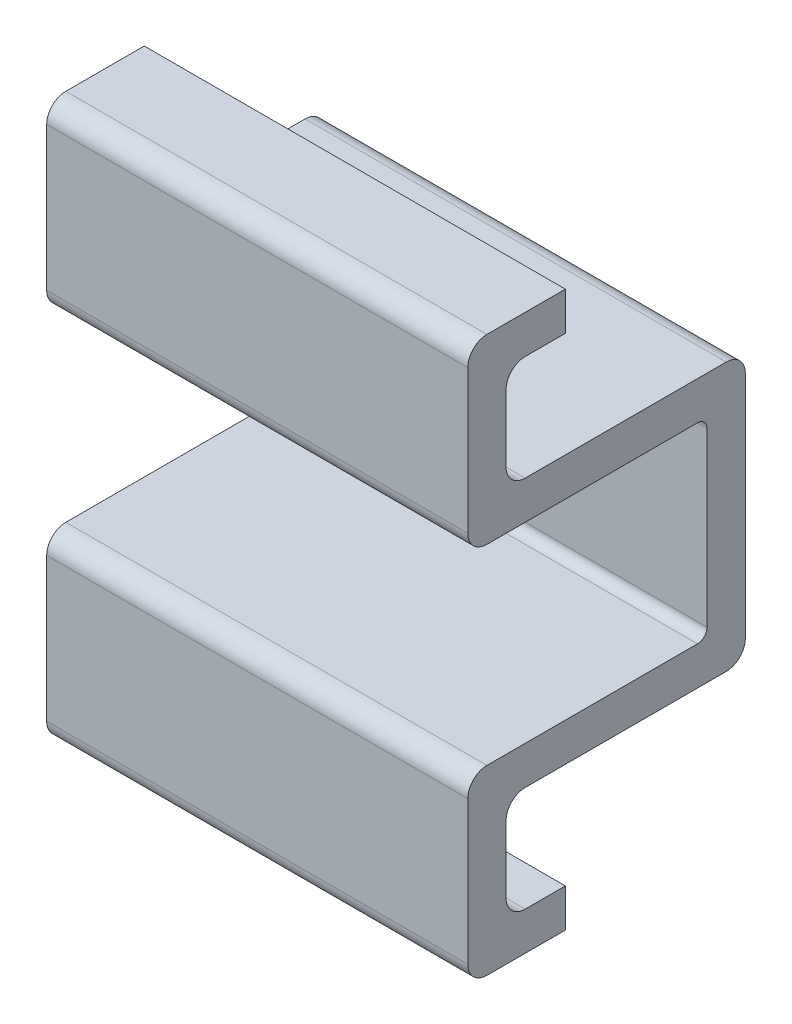
ISO-10303-21;
HEADER;
FILE_DESCRIPTION(('STEP AP214'),'2;1');
FILE_NAME('part.step','',(''),(''),'','','');
FILE_SCHEMA(('AUTOMOTIVE_DESIGN { 1 0 10303 214 1 1 1 1 }'));
ENDSEC;
DATA;
#1=APPLICATION_CONTEXT('core data for automotive mechanical design processes');
#2=APPLICATION_PROTOCOL_DEFINITION('international standard','automotive_design',2000,#1);
#3=PRODUCT_CONTEXT('',#1,'mechanical');
#4=PRODUCT('Part','Part','',(#3));
#5=PRODUCT_RELATED_PRODUCT_CATEGORY('part','',(#4));
#6=PRODUCT_DEFINITION_FORMATION('','',#4);
#7=PRODUCT_DEFINITION_CONTEXT('part definition',#1,'design');
#8=PRODUCT_DEFINITION('design','',#6,#7);
#9=PRODUCT_DEFINITION_SHAPE('','',#8);
#10=(LENGTH_UNIT() NAMED_UNIT(*) SI_UNIT(.MILLI.,.METRE.));
#11=(NAMED_UNIT(*) PLANE_ANGLE_UNIT() SI_UNIT($,.RADIAN.));
#12=(NAMED_UNIT(*) SI_UNIT($,.STERADIAN.) SOLID_ANGLE_UNIT());
#13=UNCERTAINTY_MEASURE_WITH_UNIT(LENGTH_MEASURE(1.E-05),#10,'distance_accuracy_value','');
#14=(GEOMETRIC_REPRESENTATION_CONTEXT(3) GLOBAL_UNCERTAINTY_ASSIGNED_CONTEXT((#13)) GLOBAL_UNIT_ASSIGNED_CONTEXT((#10,
#11,#12)) REPRESENTATION_CONTEXT('',''));
#15=CARTESIAN_POINT('',(0.,0.,0.));
#16=DIRECTION('',(0.,0.,1.));
#17=DIRECTION('',(1.,0.,0.));
#18=AXIS2_PLACEMENT_3D('',#15,#16,#17);
#19=CARTESIAN_POINT('',(22.,0.,13.1316966964459));
#20=DIRECTION('',(0.,0.,1.));
#21=DIRECTION('',(1.,0.,0.));
#22=AXIS2_PLACEMENT_3D('',#19,#20,#21);
#23=PLANE('',#22);
#24=DIRECTION('',(0.,1.,0.));
#25=VECTOR('',#24,1.);
#26=CARTESIAN_POINT('',(0.,0.,13.1316966964459));
#27=LINE('',#26,#25);
#28=CARTESIAN_POINT('',(0.,-14.5,13.1316966964459));
#29=VERTEX_POINT('',#28);
#30=CARTESIAN_POINT('',(0.,-12.5,13.1316966964459));
#31=VERTEX_POINT('',#30);
#32=EDGE_CURVE('E244',#29,#31,#27,.T.);
#33=ORIENTED_EDGE('',*,*,#32,.T.);
#34=DIRECTION('',(-1.,0.,0.));
#35=VECTOR('',#34,1.);
#36=CARTESIAN_POINT('',(22.,-12.5,13.1316966964459));
#37=LINE('',#36,#35);
#38=CARTESIAN_POINT('',(22.,-12.5,13.1316966964459));
#39=VERTEX_POINT('',#38);
#40=EDGE_CURVE('E225',#39,#31,#37,.T.);
#41=ORIENTED_EDGE('',*,*,#40,.F.);
#42=DIRECTION('',(0.,1.,0.));
#43=VECTOR('',#42,1.);
#44=CARTESIAN_POINT('',(22.,0.,13.1316966964459));
#45=LINE('',#44,#43);
#46=CARTESIAN_POINT('',(22.,-14.5,13.1316966964459));
#47=VERTEX_POINT('',#46);
#48=EDGE_CURVE('E231',#47,#39,#45,.T.);
#49=ORIENTED_EDGE('',*,*,#48,.F.);
#50=DIRECTION('',(-1.,0.,0.));
#51=VECTOR('',#50,1.);
#52=CARTESIAN_POINT('',(22.,-14.5,13.1316966964459));
#53=LINE('',#52,#51);
#54=EDGE_CURVE('E384',#47,#29,#53,.T.);
#55=ORIENTED_EDGE('',*,*,#54,.T.);
#56=EDGE_LOOP('',(#33,#41,#49,#55));
#57=FACE_BOUND('',#56,.T.);
#58=ADVANCED_FACE('F36',(#57),#23,.F.);
#59=CARTESIAN_POINT('',(22.,-12.5,0.));
#60=DIRECTION('',(0.,-1.,0.));
#61=DIRECTION('',(0.,0.,-1.));
#62=AXIS2_PLACEMENT_3D('',#59,#60,#61);
#63=PLANE('',#62);
#64=DIRECTION('',(0.,0.,1.));
#65=VECTOR('',#64,1.);
#66=CARTESIAN_POINT('',(0.,-12.5,0.));
#67=LINE('',#66,#65);
#68=CARTESIAN_POINT('',(0.,-12.5,15.2292675484302));
#69=VERTEX_POINT('',#68);
#70=EDGE_CURVE('E386',#31,#69,#67,.T.);
#71=ORIENTED_EDGE('',*,*,#70,.T.);
#72=DIRECTION('',(-1.,0.,0.));
#73=VECTOR('',#72,1.);
#74=CARTESIAN_POINT('',(22.,-12.5,15.2292675484302));
#75=LINE('',#74,#73);
#76=CARTESIAN_POINT('',(22.,-12.5,15.2292675484302));
#77=VERTEX_POINT('',#76);
#78=EDGE_CURVE('E228',#69,#77,#75,.F.);
#79=ORIENTED_EDGE('',*,*,#78,.T.);
#80=DIRECTION('',(0.,0.,1.));
#81=VECTOR('',#80,1.);
#82=CARTESIAN_POINT('',(22.,-12.5,0.));
#83=LINE('',#82,#81);
#84=EDGE_CURVE('E220',#39,#77,#83,.T.);
#85=ORIENTED_EDGE('',*,*,#84,.F.);
#86=ORIENTED_EDGE('',*,*,#40,.T.);
#87=EDGE_LOOP('',(#71,#79,#85,#86));
#88=FACE_BOUND('',#87,.T.);
#89=ADVANCED_FACE('F223',(#88),#63,.F.);
#90=CARTESIAN_POINT('',(22.,0.,16.2292675484302));
#91=DIRECTION('',(0.,0.,-1.));
#92=DIRECTION('',(-1.,0.,0.));
#93=AXIS2_PLACEMENT_3D('',#90,#91,#92);
#94=PLANE('',#93);
#95=DIRECTION('',(0.,-1.,0.));
#96=VECTOR('',#95,1.);
#97=CARTESIAN_POINT('',(0.,0.,16.2292675484302));
#98=LINE('',#97,#96);
#99=CARTESIAN_POINT('',(0.,-8.,16.2292675484302));
#100=VERTEX_POINT('',#99);
#101=CARTESIAN_POINT('',(0.,-11.5,16.2292675484302));
#102=VERTEX_POINT('',#101);
#103=EDGE_CURVE('E388',#100,#102,#98,.T.);
#104=ORIENTED_EDGE('',*,*,#103,.F.);
#105=DIRECTION('',(-1.,0.,0.));
#106=VECTOR('',#105,1.);
#107=CARTESIAN_POINT('',(22.,-8.,16.2292675484302));
#108=LINE('',#107,#106);
#109=CARTESIAN_POINT('',(22.,-8.,16.2292675484302));
#110=VERTEX_POINT('',#109);
#111=EDGE_CURVE('E313',#100,#110,#108,.F.);
#112=ORIENTED_EDGE('',*,*,#111,.T.);
#113=DIRECTION('',(0.,-1.,0.));
#114=VECTOR('',#113,1.);
#115=CARTESIAN_POINT('',(22.,0.,16.2292675484302));
#116=LINE('',#115,#114);
#117=CARTESIAN_POINT('',(22.,-11.5,16.2292675484302));
#118=VERTEX_POINT('',#117);
#119=EDGE_CURVE('E230',#110,#118,#116,.T.);
#120=ORIENTED_EDGE('',*,*,#119,.T.);
#121=DIRECTION('',(-1.,0.,0.));
#122=VECTOR('',#121,1.);
#123=CARTESIAN_POINT('',(22.,-11.5,16.2292675484302));
#124=LINE('',#123,#122);
#125=EDGE_CURVE('E310',#118,#102,#124,.T.);
#126=ORIENTED_EDGE('',*,*,#125,.T.);
#127=EDGE_LOOP('',(#104,#112,#120,#126));
#128=FACE_BOUND('',#127,.T.);
#129=ADVANCED_FACE('F470',(#128),#94,.T.);
#130=CARTESIAN_POINT('',(22.,-7.,0.));
#131=DIRECTION('',(0.,-1.,0.));
#132=DIRECTION('',(0.,0.,-1.));
#133=AXIS2_PLACEMENT_3D('',#130,#131,#132);
#134=PLANE('',#133);
#135=DIRECTION('',(0.,0.,1.));
#136=VECTOR('',#135,1.);
#137=CARTESIAN_POINT('',(0.,-7.,0.));
#138=LINE('',#137,#136);
#139=CARTESIAN_POINT('',(0.,-7.,4.72926754843017));
#140=VERTEX_POINT('',#139);
#141=CARTESIAN_POINT('',(0.,-7.,15.2292675484302));
#142=VERTEX_POINT('',#141);
#143=EDGE_CURVE('E391',#140,#142,#138,.T.);
#144=ORIENTED_EDGE('',*,*,#143,.F.);
#145=DIRECTION('',(-1.,0.,0.));
#146=VECTOR('',#145,1.);
#147=CARTESIAN_POINT('',(22.,-7.,4.72926754843017));
#148=LINE('',#147,#146);
#149=CARTESIAN_POINT('',(22.,-7.,4.72926754843017));
#150=VERTEX_POINT('',#149);
#151=EDGE_CURVE('E272',#140,#150,#148,.F.);
#152=ORIENTED_EDGE('',*,*,#151,.T.);
#153=DIRECTION('',(0.,0.,1.));
#154=VECTOR('',#153,1.);
#155=CARTESIAN_POINT('',(22.,-7.,0.));
#156=LINE('',#155,#154);
#157=CARTESIAN_POINT('',(22.,-7.,15.2292675484302));
#158=VERTEX_POINT('',#157);
#159=EDGE_CURVE('E462',#150,#158,#156,.T.);
#160=ORIENTED_EDGE('',*,*,#159,.T.);
#161=DIRECTION('',(-1.,0.,0.));
#162=VECTOR('',#161,1.);
#163=CARTESIAN_POINT('',(0.,-7.,15.2292675484302));
#164=LINE('',#163,#162);
#165=EDGE_CURVE('E269',#158,#142,#164,.T.);
#166=ORIENTED_EDGE('',*,*,#165,.T.);
#167=EDGE_LOOP('',(#144,#152,#160,#166));
#168=FACE_BOUND('',#167,.T.);
#169=ADVANCED_FACE('F481',(#168),#134,.T.);
#170=CARTESIAN_POINT('',(22.,0.,3.72926754843018));
#171=DIRECTION('',(0.,0.,-1.));
#172=DIRECTION('',(0.,1.,0.));
#173=AXIS2_PLACEMENT_3D('',#170,#171,#172);
#174=PLANE('',#173);
#175=DIRECTION('',(0.,-1.,0.));
#176=VECTOR('',#175,1.);
#177=CARTESIAN_POINT('',(22.,0.,3.72926754843018));
#178=LINE('',#177,#176);
#179=CARTESIAN_POINT('',(22.,6.,3.72926754843018));
#180=VERTEX_POINT('',#179);
#181=CARTESIAN_POINT('',(22.,-6.,3.72926754843017));
#182=VERTEX_POINT('',#181);
#183=EDGE_CURVE('E459',#180,#182,#178,.T.);
#184=ORIENTED_EDGE('',*,*,#183,.T.);
#185=DIRECTION('',(-1.,0.,0.));
#186=VECTOR('',#185,1.);
#187=CARTESIAN_POINT('',(22.,-6.,3.72926754843017));
#188=LINE('',#187,#186);
#189=CARTESIAN_POINT('',(0.,-6.,3.72926754843017));
#190=VERTEX_POINT('',#189);
#191=EDGE_CURVE('E248',#182,#190,#188,.T.);
#192=ORIENTED_EDGE('',*,*,#191,.T.);
#193=DIRECTION('',(0.,-1.,0.));
#194=VECTOR('',#193,1.);
#195=CARTESIAN_POINT('',(0.,0.,3.72926754843018));
#196=LINE('',#195,#194);
#197=CARTESIAN_POINT('',(0.,6.,3.72926754843018));
#198=VERTEX_POINT('',#197);
#199=EDGE_CURVE('E394',#198,#190,#196,.T.);
#200=ORIENTED_EDGE('',*,*,#199,.F.);
#201=DIRECTION('',(-1.,0.,0.));
#202=VECTOR('',#201,1.);
#203=CARTESIAN_POINT('',(22.,6.,3.72926754843018));
#204=LINE('',#203,#202);
#205=EDGE_CURVE('E245',#198,#180,#204,.F.);
#206=ORIENTED_EDGE('',*,*,#205,.T.);
#207=EDGE_LOOP('',(#184,#192,#200,#206));
#208=FACE_BOUND('',#207,.T.);
#209=ADVANCED_FACE('F489',(#208),#174,.T.);
#210=CARTESIAN_POINT('',(22.,7.,0.));
#211=DIRECTION('',(0.,-1.,0.));
#212=DIRECTION('',(0.,0.,-1.));
#213=AXIS2_PLACEMENT_3D('',#210,#211,#212);
#214=PLANE('',#213);
#215=DIRECTION('',(0.,0.,1.));
#216=VECTOR('',#215,1.);
#217=CARTESIAN_POINT('',(22.,7.,0.));
#218=LINE('',#217,#216);
#219=CARTESIAN_POINT('',(22.,7.,4.72926754843018));
#220=VERTEX_POINT('',#219);
#221=CARTESIAN_POINT('',(22.,7.,15.2292675484302));
#222=VERTEX_POINT('',#221);
#223=EDGE_CURVE('E456',#220,#222,#218,.T.);
#224=ORIENTED_EDGE('',*,*,#223,.F.);
#225=DIRECTION('',(-1.,0.,0.));
#226=VECTOR('',#225,1.);
#227=CARTESIAN_POINT('',(0.,7.,4.72926754843018));
#228=LINE('',#227,#226);
#229=CARTESIAN_POINT('',(0.,7.,4.72926754843018));
#230=VERTEX_POINT('',#229);
#231=EDGE_CURVE('E289',#220,#230,#228,.T.);
#232=ORIENTED_EDGE('',*,*,#231,.T.);
#233=DIRECTION('',(0.,0.,1.));
#234=VECTOR('',#233,1.);
#235=CARTESIAN_POINT('',(0.,7.,0.));
#236=LINE('',#235,#234);
#237=CARTESIAN_POINT('',(0.,7.,15.2292675484302));
#238=VERTEX_POINT('',#237);
#239=EDGE_CURVE('E396',#230,#238,#236,.T.);
#240=ORIENTED_EDGE('',*,*,#239,.T.);
#241=DIRECTION('',(-1.,0.,0.));
#242=VECTOR('',#241,1.);
#243=CARTESIAN_POINT('',(22.,7.,15.2292675484302));
#244=LINE('',#243,#242);
#245=EDGE_CURVE('E287',#238,#222,#244,.F.);
#246=ORIENTED_EDGE('',*,*,#245,.T.);
#247=EDGE_LOOP('',(#224,#232,#240,#246));
#248=FACE_BOUND('',#247,.T.);
#249=ADVANCED_FACE('F498',(#248),#214,.F.);
#250=CARTESIAN_POINT('',(22.,0.,16.2292675484302));
#251=DIRECTION('',(0.,0.,1.));
#252=DIRECTION('',(1.,0.,0.));
#253=AXIS2_PLACEMENT_3D('',#250,#251,#252);
#254=PLANE('',#253);
#255=DIRECTION('',(0.,1.,0.));
#256=VECTOR('',#255,1.);
#257=CARTESIAN_POINT('',(0.,0.,16.2292675484302));
#258=LINE('',#257,#256);
#259=CARTESIAN_POINT('',(0.,8.,16.2292675484302));
#260=VERTEX_POINT('',#259);
#261=CARTESIAN_POINT('',(0.,11.5,16.2292675484302));
#262=VERTEX_POINT('',#261);
#263=EDGE_CURVE('E399',#260,#262,#258,.T.);
#264=ORIENTED_EDGE('',*,*,#263,.T.);
#265=DIRECTION('',(-1.,0.,0.));
#266=VECTOR('',#265,1.);
#267=CARTESIAN_POINT('',(22.,11.5,16.2292675484302));
#268=LINE('',#267,#266);
#269=CARTESIAN_POINT('',(22.,11.5,16.2292675484302));
#270=VERTEX_POINT('',#269);
#271=EDGE_CURVE('E308',#262,#270,#268,.F.);
#272=ORIENTED_EDGE('',*,*,#271,.T.);
#273=DIRECTION('',(0.,1.,0.));
#274=VECTOR('',#273,1.);
#275=CARTESIAN_POINT('',(22.,0.,16.2292675484302));
#276=LINE('',#275,#274);
#277=CARTESIAN_POINT('',(22.,8.,16.2292675484302));
#278=VERTEX_POINT('',#277);
#279=EDGE_CURVE('E453',#278,#270,#276,.T.);
#280=ORIENTED_EDGE('',*,*,#279,.F.);
#281=DIRECTION('',(-1.,0.,0.));
#282=VECTOR('',#281,1.);
#283=CARTESIAN_POINT('',(0.,8.,16.2292675484302));
#284=LINE('',#283,#282);
#285=EDGE_CURVE('E305',#278,#260,#284,.T.);
#286=ORIENTED_EDGE('',*,*,#285,.T.);
#287=EDGE_LOOP('',(#264,#272,#280,#286));
#288=FACE_BOUND('',#287,.T.);
#289=ADVANCED_FACE('F507',(#288),#254,.F.);
#290=CARTESIAN_POINT('',(22.,12.5,0.));
#291=DIRECTION('',(0.,-1.,0.));
#292=DIRECTION('',(0.,0.,-1.));
#293=AXIS2_PLACEMENT_3D('',#290,#291,#292);
#294=PLANE('',#293);
#295=DIRECTION('',(0.,0.,1.));
#296=VECTOR('',#295,1.);
#297=CARTESIAN_POINT('',(22.,12.5,0.));
#298=LINE('',#297,#296);
#299=CARTESIAN_POINT('',(22.,12.5,13.1316966964459));
#300=VERTEX_POINT('',#299);
#301=CARTESIAN_POINT('',(22.,12.5,15.2292675484302));
#302=VERTEX_POINT('',#301);
#303=EDGE_CURVE('E450',#300,#302,#298,.T.);
#304=ORIENTED_EDGE('',*,*,#303,.T.);
#305=DIRECTION('',(-1.,0.,0.));
#306=VECTOR('',#305,1.);
#307=CARTESIAN_POINT('',(22.,12.5,15.2292675484302));
#308=LINE('',#307,#306);
#309=CARTESIAN_POINT('',(0.,12.5,15.2292675484302));
#310=VERTEX_POINT('',#309);
#311=EDGE_CURVE('E302',#302,#310,#308,.T.);
#312=ORIENTED_EDGE('',*,*,#311,.T.);
#313=DIRECTION('',(0.,0.,1.));
#314=VECTOR('',#313,1.);
#315=CARTESIAN_POINT('',(0.,12.5,0.));
#316=LINE('',#315,#314);
#317=CARTESIAN_POINT('',(0.,12.5,13.1316966964459));
#318=VERTEX_POINT('',#317);
#319=EDGE_CURVE('E402',#318,#310,#316,.T.);
#320=ORIENTED_EDGE('',*,*,#319,.F.);
#321=DIRECTION('',(-1.,0.,0.));
#322=VECTOR('',#321,1.);
#323=CARTESIAN_POINT('',(22.,12.5,13.1316966964459));
#324=LINE('',#323,#322);
#325=EDGE_CURVE('E246',#300,#318,#324,.T.);
#326=ORIENTED_EDGE('',*,*,#325,.F.);
#327=EDGE_LOOP('',(#304,#312,#320,#326));
#328=FACE_BOUND('',#327,.T.);
#329=ADVANCED_FACE('F515',(#328),#294,.T.);
#330=CARTESIAN_POINT('',(22.,0.,13.1316966964459));
#331=DIRECTION('',(0.,0.,-1.));
#332=DIRECTION('',(-1.,0.,0.));
#333=AXIS2_PLACEMENT_3D('',#330,#331,#332);
#334=PLANE('',#333);
#335=DIRECTION('',(0.,-1.,0.));
#336=VECTOR('',#335,1.);
#337=CARTESIAN_POINT('',(0.,0.,13.1316966964459));
#338=LINE('',#337,#336);
#339=CARTESIAN_POINT('',(0.,14.5,13.1316966964459));
#340=VERTEX_POINT('',#339);
#341=EDGE_CURVE('E405',#340,#318,#338,.T.);
#342=ORIENTED_EDGE('',*,*,#341,.F.);
#343=DIRECTION('',(-1.,0.,0.));
#344=VECTOR('',#343,1.);
#345=CARTESIAN_POINT('',(22.,14.5,13.1316966964459));
#346=LINE('',#345,#344);
#347=CARTESIAN_POINT('',(22.,14.5,13.1316966964459));
#348=VERTEX_POINT('',#347);
#349=EDGE_CURVE('E250',#348,#340,#346,.T.);
#350=ORIENTED_EDGE('',*,*,#349,.F.);
#351=DIRECTION('',(0.,-1.,0.));
#352=VECTOR('',#351,1.);
#353=CARTESIAN_POINT('',(22.,0.,13.1316966964459));
#354=LINE('',#353,#352);
#355=EDGE_CURVE('E446',#348,#300,#354,.T.);
#356=ORIENTED_EDGE('',*,*,#355,.T.);
#357=ORIENTED_EDGE('',*,*,#325,.T.);
#358=EDGE_LOOP('',(#342,#350,#356,#357));
#359=FACE_BOUND('',#358,.T.);
#360=ADVANCED_FACE('F431',(#359),#334,.T.);
#361=CARTESIAN_POINT('',(22.,14.5,0.));
#362=DIRECTION('',(0.,1.,0.));
#363=DIRECTION('',(0.,0.,1.));
#364=AXIS2_PLACEMENT_3D('',#361,#362,#363);
#365=PLANE('',#364);
#366=DIRECTION('',(0.,0.,-1.));
#367=VECTOR('',#366,1.);
#368=CARTESIAN_POINT('',(0.,14.5,0.));
#369=LINE('',#368,#367);
#370=CARTESIAN_POINT('',(0.,14.5,17.2292675484302));
#371=VERTEX_POINT('',#370);
#372=EDGE_CURVE('E408',#371,#340,#369,.T.);
#373=ORIENTED_EDGE('',*,*,#372,.F.);
#374=DIRECTION('',(-1.,0.,0.));
#375=VECTOR('',#374,1.);
#376=CARTESIAN_POINT('',(22.,14.5,17.2292675484302));
#377=LINE('',#376,#375);
#378=CARTESIAN_POINT('',(22.,14.5,17.2292675484302));
#379=VERTEX_POINT('',#378);
#380=EDGE_CURVE('E297',#371,#379,#377,.F.);
#381=ORIENTED_EDGE('',*,*,#380,.T.);
#382=DIRECTION('',(0.,0.,-1.));
#383=VECTOR('',#382,1.);
#384=CARTESIAN_POINT('',(22.,14.5,0.));
#385=LINE('',#384,#383);
#386=EDGE_CURVE('E427',#379,#348,#385,.T.);
#387=ORIENTED_EDGE('',*,*,#386,.T.);
#388=ORIENTED_EDGE('',*,*,#349,.T.);
#389=EDGE_LOOP('',(#373,#381,#387,#388));
#390=FACE_BOUND('',#389,.T.);
#391=ADVANCED_FACE('F424',(#390),#365,.T.);
#392=CARTESIAN_POINT('',(22.,0.,18.2292675484302));
#393=DIRECTION('',(0.,0.,1.));
#394=DIRECTION('',(1.,0.,0.));
#395=AXIS2_PLACEMENT_3D('',#392,#393,#394);
#396=PLANE('',#395);
#397=DIRECTION('',(0.,1.,0.));
#398=VECTOR('',#397,1.);
#399=CARTESIAN_POINT('',(22.,0.,18.2292675484302));
#400=LINE('',#399,#398);
#401=CARTESIAN_POINT('',(22.,6.,18.2292675484302));
#402=VERTEX_POINT('',#401);
#403=CARTESIAN_POINT('',(22.,13.5,18.2292675484302));
#404=VERTEX_POINT('',#403);
#405=EDGE_CURVE('E443',#402,#404,#400,.T.);
#406=ORIENTED_EDGE('',*,*,#405,.T.);
#407=DIRECTION('',(-1.,0.,0.));
#408=VECTOR('',#407,1.);
#409=CARTESIAN_POINT('',(22.,13.5,18.2292675484302));
#410=LINE('',#409,#408);
#411=CARTESIAN_POINT('',(0.,13.5,18.2292675484302));
#412=VERTEX_POINT('',#411);
#413=EDGE_CURVE('E294',#404,#412,#410,.T.);
#414=ORIENTED_EDGE('',*,*,#413,.T.);
#415=DIRECTION('',(0.,1.,0.));
#416=VECTOR('',#415,1.);
#417=CARTESIAN_POINT('',(0.,0.,18.2292675484302));
#418=LINE('',#417,#416);
#419=CARTESIAN_POINT('',(0.,6.,18.2292675484302));
#420=VERTEX_POINT('',#419);
#421=EDGE_CURVE('E410',#420,#412,#418,.T.);
#422=ORIENTED_EDGE('',*,*,#421,.F.);
#423=DIRECTION('',(-1.,0.,0.));
#424=VECTOR('',#423,1.);
#425=CARTESIAN_POINT('',(22.,6.,18.2292675484302));
#426=LINE('',#425,#424);
#427=EDGE_CURVE('E292',#420,#402,#426,.F.);
#428=ORIENTED_EDGE('',*,*,#427,.T.);
#429=EDGE_LOOP('',(#406,#414,#422,#428));
#430=FACE_BOUND('',#429,.T.);
#431=ADVANCED_FACE('F440',(#430),#396,.T.);
#432=CARTESIAN_POINT('',(22.,5.,0.));
#433=DIRECTION('',(0.,-1.,0.));
#434=DIRECTION('',(0.,0.,-1.));
#435=AXIS2_PLACEMENT_3D('',#432,#433,#434);
#436=PLANE('',#435);
#437=DIRECTION('',(0.,0.,1.));
#438=VECTOR('',#437,1.);
#439=CARTESIAN_POINT('',(0.,5.,0.));
#440=LINE('',#439,#438);
#441=CARTESIAN_POINT('',(0.,5.,6.22926754843018));
#442=VERTEX_POINT('',#441);
#443=CARTESIAN_POINT('',(0.,5.,17.2292675484302));
#444=VERTEX_POINT('',#443);
#445=EDGE_CURVE('E367',#442,#444,#440,.T.);
#446=ORIENTED_EDGE('',*,*,#445,.F.);
#447=DIRECTION('',(-1.,0.,0.));
#448=VECTOR('',#447,1.);
#449=CARTESIAN_POINT('',(22.,5.,6.22926754843018));
#450=LINE('',#449,#448);
#451=CARTESIAN_POINT('',(22.,5.,6.22926754843018));
#452=VERTEX_POINT('',#451);
#453=EDGE_CURVE('E348',#442,#452,#450,.F.);
#454=ORIENTED_EDGE('',*,*,#453,.T.);
#455=DIRECTION('',(0.,0.,1.));
#456=VECTOR('',#455,1.);
#457=CARTESIAN_POINT('',(22.,5.,0.));
#458=LINE('',#457,#456);
#459=CARTESIAN_POINT('',(22.,5.,17.2292675484302));
#460=VERTEX_POINT('',#459);
#461=EDGE_CURVE('E379',#452,#460,#458,.T.);
#462=ORIENTED_EDGE('',*,*,#461,.T.);
#463=DIRECTION('',(-1.,0.,0.));
#464=VECTOR('',#463,1.);
#465=CARTESIAN_POINT('',(22.,5.,17.2292675484302));
#466=LINE('',#465,#464);
#467=EDGE_CURVE('E299',#460,#444,#466,.T.);
#468=ORIENTED_EDGE('',*,*,#467,.T.);
#469=EDGE_LOOP('',(#446,#454,#462,#468));
#470=FACE_BOUND('',#469,.T.);
#471=ADVANCED_FACE('F569',(#470),#436,.T.);
#472=CARTESIAN_POINT('',(22.,0.,5.72926754843018));
#473=DIRECTION('',(0.,0.,-1.));
#474=DIRECTION('',(0.,1.,0.));
#475=AXIS2_PLACEMENT_3D('',#472,#473,#474);
#476=PLANE('',#475);
#477=DIRECTION('',(0.,-1.,0.));
#478=VECTOR('',#477,1.);
#479=CARTESIAN_POINT('',(22.,0.,5.72926754843018));
#480=LINE('',#479,#478);
#481=CARTESIAN_POINT('',(22.,4.5,5.72926754843018));
#482=VERTEX_POINT('',#481);
#483=CARTESIAN_POINT('',(22.,-4.5,5.72926754843017));
#484=VERTEX_POINT('',#483);
#485=EDGE_CURVE('E375',#482,#484,#480,.T.);
#486=ORIENTED_EDGE('',*,*,#485,.F.);
#487=DIRECTION('',(-1.,0.,0.));
#488=VECTOR('',#487,1.);
#489=CARTESIAN_POINT('',(22.,4.5,5.72926754843018));
#490=LINE('',#489,#488);
#491=CARTESIAN_POINT('',(0.,4.5,5.72926754843018));
#492=VERTEX_POINT('',#491);
#493=EDGE_CURVE('E345',#482,#492,#490,.T.);
#494=ORIENTED_EDGE('',*,*,#493,.T.);
#495=DIRECTION('',(0.,-1.,0.));
#496=VECTOR('',#495,1.);
#497=CARTESIAN_POINT('',(0.,0.,5.72926754843018));
#498=LINE('',#497,#496);
#499=CARTESIAN_POINT('',(0.,-4.5,5.72926754843017));
#500=VERTEX_POINT('',#499);
#501=EDGE_CURVE('E361',#492,#500,#498,.T.);
#502=ORIENTED_EDGE('',*,*,#501,.T.);
#503=DIRECTION('',(-1.,0.,0.));
#504=VECTOR('',#503,1.);
#505=CARTESIAN_POINT('',(22.,-4.5,5.72926754843017));
#506=LINE('',#505,#504);
#507=EDGE_CURVE('E343',#500,#484,#506,.F.);
#508=ORIENTED_EDGE('',*,*,#507,.T.);
#509=EDGE_LOOP('',(#486,#494,#502,#508));
#510=FACE_BOUND('',#509,.T.);
#511=ADVANCED_FACE('F365',(#510),#476,.F.);
#512=CARTESIAN_POINT('',(22.,-5.,0.));
#513=DIRECTION('',(0.,-1.,0.));
#514=DIRECTION('',(0.,0.,-1.));
#515=AXIS2_PLACEMENT_3D('',#512,#513,#514);
#516=PLANE('',#515);
#517=DIRECTION('',(0.,0.,1.));
#518=VECTOR('',#517,1.);
#519=CARTESIAN_POINT('',(22.,-5.,0.));
#520=LINE('',#519,#518);
#521=CARTESIAN_POINT('',(22.,-5.,6.22926754843017));
#522=VERTEX_POINT('',#521);
#523=CARTESIAN_POINT('',(22.,-5.,17.2292675484302));
#524=VERTEX_POINT('',#523);
#525=EDGE_CURVE('E371',#522,#524,#520,.T.);
#526=ORIENTED_EDGE('',*,*,#525,.F.);
#527=DIRECTION('',(-1.,0.,0.));
#528=VECTOR('',#527,1.);
#529=CARTESIAN_POINT('',(0.,-5.,6.22926754843017));
#530=LINE('',#529,#528);
#531=CARTESIAN_POINT('',(0.,-5.,6.22926754843017));
#532=VERTEX_POINT('',#531);
#533=EDGE_CURVE('E350',#522,#532,#530,.T.);
#534=ORIENTED_EDGE('',*,*,#533,.T.);
#535=DIRECTION('',(0.,0.,1.));
#536=VECTOR('',#535,1.);
#537=CARTESIAN_POINT('',(0.,-5.,0.));
#538=LINE('',#537,#536);
#539=CARTESIAN_POINT('',(0.,-5.,17.2292675484302));
#540=VERTEX_POINT('',#539);
#541=EDGE_CURVE('E362',#532,#540,#538,.T.);
#542=ORIENTED_EDGE('',*,*,#541,.T.);
#543=DIRECTION('',(-1.,0.,0.));
#544=VECTOR('',#543,1.);
#545=CARTESIAN_POINT('',(22.,-5.,17.2292675484302));
#546=LINE('',#545,#544);
#547=EDGE_CURVE('E324',#540,#524,#546,.F.);
#548=ORIENTED_EDGE('',*,*,#547,.T.);
#549=EDGE_LOOP('',(#526,#534,#542,#548));
#550=FACE_BOUND('',#549,.T.);
#551=ADVANCED_FACE('F370',(#550),#516,.F.);
#552=CARTESIAN_POINT('',(22.,0.,18.2292675484302));
#553=DIRECTION('',(0.,0.,-1.));
#554=DIRECTION('',(-1.,0.,0.));
#555=AXIS2_PLACEMENT_3D('',#552,#553,#554);
#556=PLANE('',#555);
#557=DIRECTION('',(0.,-1.,0.));
#558=VECTOR('',#557,1.);
#559=CARTESIAN_POINT('',(0.,0.,18.2292675484302));
#560=LINE('',#559,#558);
#561=CARTESIAN_POINT('',(0.,-6.,18.2292675484302));
#562=VERTEX_POINT('',#561);
#563=CARTESIAN_POINT('',(0.,-13.5,18.2292675484302));
#564=VERTEX_POINT('',#563);
#565=EDGE_CURVE('E415',#562,#564,#560,.T.);
#566=ORIENTED_EDGE('',*,*,#565,.T.);
#567=DIRECTION('',(-1.,0.,0.));
#568=VECTOR('',#567,1.);
#569=CARTESIAN_POINT('',(22.,-13.5,18.2292675484302));
#570=LINE('',#569,#568);
#571=CARTESIAN_POINT('',(22.,-13.5,18.2292675484302));
#572=VERTEX_POINT('',#571);
#573=EDGE_CURVE('E322',#564,#572,#570,.F.);
#574=ORIENTED_EDGE('',*,*,#573,.T.);
#575=DIRECTION('',(0.,-1.,0.));
#576=VECTOR('',#575,1.);
#577=CARTESIAN_POINT('',(22.,0.,18.2292675484302));
#578=LINE('',#577,#576);
#579=CARTESIAN_POINT('',(22.,-6.,18.2292675484302));
#580=VERTEX_POINT('',#579);
#581=EDGE_CURVE('E374',#580,#572,#578,.T.);
#582=ORIENTED_EDGE('',*,*,#581,.F.);
#583=DIRECTION('',(-1.,0.,0.));
#584=VECTOR('',#583,1.);
#585=CARTESIAN_POINT('',(22.,-6.,18.2292675484302));
#586=LINE('',#585,#584);
#587=EDGE_CURVE('E319',#580,#562,#586,.T.);
#588=ORIENTED_EDGE('',*,*,#587,.T.);
#589=EDGE_LOOP('',(#566,#574,#582,#588));
#590=FACE_BOUND('',#589,.T.);
#591=ADVANCED_FACE('F596',(#590),#556,.F.);
#592=CARTESIAN_POINT('',(22.,-14.5,0.));
#593=DIRECTION('',(0.,1.,0.));
#594=DIRECTION('',(0.,0.,1.));
#595=AXIS2_PLACEMENT_3D('',#592,#593,#594);
#596=PLANE('',#595);
#597=DIRECTION('',(0.,0.,-1.));
#598=VECTOR('',#597,1.);
#599=CARTESIAN_POINT('',(22.,-14.5,0.));
#600=LINE('',#599,#598);
#601=CARTESIAN_POINT('',(22.,-14.5,17.2292675484302));
#602=VERTEX_POINT('',#601);
#603=EDGE_CURVE('E237',#602,#47,#600,.T.);
#604=ORIENTED_EDGE('',*,*,#603,.F.);
#605=DIRECTION('',(-1.,0.,0.));
#606=VECTOR('',#605,1.);
#607=CARTESIAN_POINT('',(22.,-14.5,17.2292675484302));
#608=LINE('',#607,#606);
#609=CARTESIAN_POINT('',(0.,-14.5,17.2292675484302));
#610=VERTEX_POINT('',#609);
#611=EDGE_CURVE('E316',#602,#610,#608,.T.);
#612=ORIENTED_EDGE('',*,*,#611,.T.);
#613=DIRECTION('',(0.,0.,-1.));
#614=VECTOR('',#613,1.);
#615=CARTESIAN_POINT('',(0.,-14.5,0.));
#616=LINE('',#615,#614);
#617=EDGE_CURVE('E241',#610,#29,#616,.T.);
#618=ORIENTED_EDGE('',*,*,#617,.T.);
#619=ORIENTED_EDGE('',*,*,#54,.F.);
#620=EDGE_LOOP('',(#604,#612,#618,#619));
#621=FACE_BOUND('',#620,.T.);
#622=ADVANCED_FACE('F601',(#621),#596,.F.);
#623=CARTESIAN_POINT('',(22.,0.,0.));
#624=DIRECTION('',(1.,0.,0.));
#625=DIRECTION('',(0.,0.,-1.));
#626=AXIS2_PLACEMENT_3D('',#623,#624,#625);
#627=PLANE('',#626);
#628=ORIENTED_EDGE('',*,*,#159,.F.);
#629=CARTESIAN_POINT('',(22.,-6.,4.72926754843017));
#630=DIRECTION('',(1.,0.,0.));
#631=DIRECTION('',(0.,0.,-1.));
#632=AXIS2_PLACEMENT_3D('',#629,#630,#631);
#633=CIRCLE('',#632,1.);
#634=EDGE_CURVE('E285',#150,#182,#633,.T.);
#635=ORIENTED_EDGE('',*,*,#634,.T.);
#636=ORIENTED_EDGE('',*,*,#183,.F.);
#637=CARTESIAN_POINT('',(22.,6.,4.72926754843018));
#638=DIRECTION('',(1.,0.,0.));
#639=DIRECTION('',(0.,0.,-1.));
#640=AXIS2_PLACEMENT_3D('',#637,#638,#639);
#641=CIRCLE('',#640,1.);
#642=EDGE_CURVE('E283',#180,#220,#641,.T.);
#643=ORIENTED_EDGE('',*,*,#642,.T.);
#644=ORIENTED_EDGE('',*,*,#223,.T.);
#645=CARTESIAN_POINT('',(22.,8.,15.2292675484302));
#646=DIRECTION('',(1.,0.,0.));
#647=DIRECTION('',(0.,0.,-1.));
#648=AXIS2_PLACEMENT_3D('',#645,#646,#647);
#649=CIRCLE('',#648,1.);
#650=EDGE_CURVE('E333',#222,#278,#649,.F.);
#651=ORIENTED_EDGE('',*,*,#650,.T.);
#652=ORIENTED_EDGE('',*,*,#279,.T.);
#653=CARTESIAN_POINT('',(22.,11.5,15.2292675484302));
#654=DIRECTION('',(1.,0.,0.));
#655=DIRECTION('',(0.,0.,-1.));
#656=AXIS2_PLACEMENT_3D('',#653,#654,#655);
#657=CIRCLE('',#656,1.);
#658=EDGE_CURVE('E329',#270,#302,#657,.F.);
#659=ORIENTED_EDGE('',*,*,#658,.T.);
#660=ORIENTED_EDGE('',*,*,#303,.F.);
#661=ORIENTED_EDGE('',*,*,#355,.F.);
#662=ORIENTED_EDGE('',*,*,#386,.F.);
#663=CARTESIAN_POINT('',(22.,13.5,17.2292675484302));
#664=DIRECTION('',(1.,0.,0.));
#665=DIRECTION('',(0.,0.,-1.));
#666=AXIS2_PLACEMENT_3D('',#663,#664,#665);
#667=CIRCLE('',#666,1.);
#668=EDGE_CURVE('E281',#379,#404,#667,.T.);
#669=ORIENTED_EDGE('',*,*,#668,.T.);
#670=ORIENTED_EDGE('',*,*,#405,.F.);
#671=CARTESIAN_POINT('',(22.,6.,17.2292675484302));
#672=DIRECTION('',(1.,0.,0.));
#673=DIRECTION('',(0.,0.,-1.));
#674=AXIS2_PLACEMENT_3D('',#671,#672,#673);
#675=CIRCLE('',#674,1.);
#676=EDGE_CURVE('E278',#402,#460,#675,.T.);
#677=ORIENTED_EDGE('',*,*,#676,.T.);
#678=ORIENTED_EDGE('',*,*,#461,.F.);
#679=CARTESIAN_POINT('',(22.,4.5,6.22926754843018));
#680=DIRECTION('',(1.,0.,0.));
#681=DIRECTION('',(0.,0.,-1.));
#682=AXIS2_PLACEMENT_3D('',#679,#680,#681);
#683=CIRCLE('',#682,0.5);
#684=EDGE_CURVE('E354',#452,#482,#683,.F.);
#685=ORIENTED_EDGE('',*,*,#684,.T.);
#686=ORIENTED_EDGE('',*,*,#485,.T.);
#687=CARTESIAN_POINT('',(22.,-4.5,6.22926754843017));
#688=DIRECTION('',(1.,0.,0.));
#689=DIRECTION('',(0.,0.,-1.));
#690=AXIS2_PLACEMENT_3D('',#687,#688,#689);
#691=CIRCLE('',#690,0.5);
#692=EDGE_CURVE('E11',#484,#522,#691,.F.);
#693=ORIENTED_EDGE('',*,*,#692,.T.);
#694=ORIENTED_EDGE('',*,*,#525,.T.);
#695=CARTESIAN_POINT('',(22.,-6.,17.2292675484302));
#696=DIRECTION('',(1.,0.,0.));
#697=DIRECTION('',(0.,0.,-1.));
#698=AXIS2_PLACEMENT_3D('',#695,#696,#697);
#699=CIRCLE('',#698,1.);
#700=EDGE_CURVE('E274',#524,#580,#699,.T.);
#701=ORIENTED_EDGE('',*,*,#700,.T.);
#702=ORIENTED_EDGE('',*,*,#581,.T.);
#703=CARTESIAN_POINT('',(22.,-13.5,17.2292675484302));
#704=DIRECTION('',(1.,0.,0.));
#705=DIRECTION('',(0.,0.,-1.));
#706=AXIS2_PLACEMENT_3D('',#703,#704,#705);
#707=CIRCLE('',#706,1.);
#708=EDGE_CURVE('E276',#572,#602,#707,.T.);
#709=ORIENTED_EDGE('',*,*,#708,.T.);
#710=ORIENTED_EDGE('',*,*,#603,.T.);
#711=ORIENTED_EDGE('',*,*,#48,.T.);
#712=ORIENTED_EDGE('',*,*,#84,.T.);
#713=CARTESIAN_POINT('',(22.,-11.5,15.2292675484302));
#714=DIRECTION('',(1.,0.,0.));
#715=DIRECTION('',(0.,0.,-1.));
#716=AXIS2_PLACEMENT_3D('',#713,#714,#715);
#717=CIRCLE('',#716,1.);
#718=EDGE_CURVE('E341',#77,#118,#717,.F.);
#719=ORIENTED_EDGE('',*,*,#718,.T.);
#720=ORIENTED_EDGE('',*,*,#119,.F.);
#721=CARTESIAN_POINT('',(22.,-8.,15.2292675484302));
#722=DIRECTION('',(1.,0.,0.));
#723=DIRECTION('',(0.,0.,-1.));
#724=AXIS2_PLACEMENT_3D('',#721,#722,#723);
#725=CIRCLE('',#724,1.);
#726=EDGE_CURVE('E337',#110,#158,#725,.F.);
#727=ORIENTED_EDGE('',*,*,#726,.T.);
#728=EDGE_LOOP('',(#628,#635,#636,#643,#644,#651,#652,#659,#660,#661,#662,#669,#670,#677,#678,
#685,#686,#693,#694,#701,#702,#709,#710,#711,#712,#719,#720,#727));
#729=FACE_BOUND('',#728,.T.);
#730=ADVANCED_FACE('F235',(#729),#627,.T.);
#731=CARTESIAN_POINT('',(0.,0.,0.));
#732=DIRECTION('',(1.,0.,0.));
#733=DIRECTION('',(0.,0.,-1.));
#734=AXIS2_PLACEMENT_3D('',#731,#732,#733);
#735=PLANE('',#734);
#736=ORIENTED_EDGE('',*,*,#199,.T.);
#737=CARTESIAN_POINT('',(0.,-6.,4.72926754843017));
#738=DIRECTION('',(1.,0.,0.));
#739=DIRECTION('',(0.,0.,-1.));
#740=AXIS2_PLACEMENT_3D('',#737,#738,#739);
#741=CIRCLE('',#740,1.);
#742=EDGE_CURVE('E267',#190,#140,#741,.F.);
#743=ORIENTED_EDGE('',*,*,#742,.T.);
#744=ORIENTED_EDGE('',*,*,#143,.T.);
#745=CARTESIAN_POINT('',(0.,-8.,15.2292675484302));
#746=DIRECTION('',(1.,0.,0.));
#747=DIRECTION('',(0.,0.,-1.));
#748=AXIS2_PLACEMENT_3D('',#745,#746,#747);
#749=CIRCLE('',#748,1.);
#750=EDGE_CURVE('E335',#142,#100,#749,.T.);
#751=ORIENTED_EDGE('',*,*,#750,.T.);
#752=ORIENTED_EDGE('',*,*,#103,.T.);
#753=CARTESIAN_POINT('',(0.,-11.5,15.2292675484302));
#754=DIRECTION('',(1.,0.,0.));
#755=DIRECTION('',(0.,0.,-1.));
#756=AXIS2_PLACEMENT_3D('',#753,#754,#755);
#757=CIRCLE('',#756,1.);
#758=EDGE_CURVE('E339',#102,#69,#757,.T.);
#759=ORIENTED_EDGE('',*,*,#758,.T.);
#760=ORIENTED_EDGE('',*,*,#70,.F.);
#761=ORIENTED_EDGE('',*,*,#32,.F.);
#762=ORIENTED_EDGE('',*,*,#617,.F.);
#763=CARTESIAN_POINT('',(0.,-13.5,17.2292675484302));
#764=DIRECTION('',(1.,0.,0.));
#765=DIRECTION('',(0.,0.,-1.));
#766=AXIS2_PLACEMENT_3D('',#763,#764,#765);
#767=CIRCLE('',#766,1.);
#768=EDGE_CURVE('E259',#610,#564,#767,.F.);
#769=ORIENTED_EDGE('',*,*,#768,.T.);
#770=ORIENTED_EDGE('',*,*,#565,.F.);
#771=CARTESIAN_POINT('',(0.,-6.,17.2292675484302));
#772=DIRECTION('',(1.,0.,0.));
#773=DIRECTION('',(0.,0.,-1.));
#774=AXIS2_PLACEMENT_3D('',#771,#772,#773);
#775=CIRCLE('',#774,1.);
#776=EDGE_CURVE('E256',#562,#540,#775,.F.);
#777=ORIENTED_EDGE('',*,*,#776,.T.);
#778=ORIENTED_EDGE('',*,*,#541,.F.);
#779=CARTESIAN_POINT('',(0.,-4.5,6.22926754843017));
#780=DIRECTION('',(1.,0.,0.));
#781=DIRECTION('',(0.,0.,-1.));
#782=AXIS2_PLACEMENT_3D('',#779,#780,#781);
#783=CIRCLE('',#782,0.5);
#784=EDGE_CURVE('E44',#532,#500,#783,.T.);
#785=ORIENTED_EDGE('',*,*,#784,.T.);
#786=ORIENTED_EDGE('',*,*,#501,.F.);
#787=CARTESIAN_POINT('',(0.,4.5,6.22926754843018));
#788=DIRECTION('',(1.,0.,0.));
#789=DIRECTION('',(0.,0.,-1.));
#790=AXIS2_PLACEMENT_3D('',#787,#788,#789);
#791=CIRCLE('',#790,0.5);
#792=EDGE_CURVE('E352',#492,#442,#791,.T.);
#793=ORIENTED_EDGE('',*,*,#792,.T.);
#794=ORIENTED_EDGE('',*,*,#445,.T.);
#795=CARTESIAN_POINT('',(0.,6.,17.2292675484302));
#796=DIRECTION('',(1.,0.,0.));
#797=DIRECTION('',(0.,0.,-1.));
#798=AXIS2_PLACEMENT_3D('',#795,#796,#797);
#799=CIRCLE('',#798,1.);
#800=EDGE_CURVE('E261',#444,#420,#799,.F.);
#801=ORIENTED_EDGE('',*,*,#800,.T.);
#802=ORIENTED_EDGE('',*,*,#421,.T.);
#803=CARTESIAN_POINT('',(0.,13.5,17.2292675484302));
#804=DIRECTION('',(1.,0.,0.));
#805=DIRECTION('',(0.,0.,-1.));
#806=AXIS2_PLACEMENT_3D('',#803,#804,#805);
#807=CIRCLE('',#806,1.);
#808=EDGE_CURVE('E263',#412,#371,#807,.F.);
#809=ORIENTED_EDGE('',*,*,#808,.T.);
#810=ORIENTED_EDGE('',*,*,#372,.T.);
#811=ORIENTED_EDGE('',*,*,#341,.T.);
#812=ORIENTED_EDGE('',*,*,#319,.T.);
#813=CARTESIAN_POINT('',(0.,11.5,15.2292675484302));
#814=DIRECTION('',(1.,0.,0.));
#815=DIRECTION('',(0.,0.,-1.));
#816=AXIS2_PLACEMENT_3D('',#813,#814,#815);
#817=CIRCLE('',#816,1.);
#818=EDGE_CURVE('E327',#310,#262,#817,.T.);
#819=ORIENTED_EDGE('',*,*,#818,.T.);
#820=ORIENTED_EDGE('',*,*,#263,.F.);
#821=CARTESIAN_POINT('',(0.,8.,15.2292675484302));
#822=DIRECTION('',(1.,0.,0.));
#823=DIRECTION('',(0.,0.,-1.));
#824=AXIS2_PLACEMENT_3D('',#821,#822,#823);
#825=CIRCLE('',#824,1.);
#826=EDGE_CURVE('E331',#260,#238,#825,.T.);
#827=ORIENTED_EDGE('',*,*,#826,.T.);
#828=ORIENTED_EDGE('',*,*,#239,.F.);
#829=CARTESIAN_POINT('',(0.,6.,4.72926754843018));
#830=DIRECTION('',(1.,0.,0.));
#831=DIRECTION('',(0.,0.,-1.));
#832=AXIS2_PLACEMENT_3D('',#829,#830,#831);
#833=CIRCLE('',#832,1.);
#834=EDGE_CURVE('E265',#230,#198,#833,.F.);
#835=ORIENTED_EDGE('',*,*,#834,.T.);
#836=EDGE_LOOP('',(#736,#743,#744,#751,#752,#759,#760,#761,#762,#769,#770,#777,#778,#785,#786,
#793,#794,#801,#802,#809,#810,#811,#812,#819,#820,#827,#828,#835));
#837=FACE_BOUND('',#836,.T.);
#838=ADVANCED_FACE('F360',(#837),#735,.F.);
#839=CARTESIAN_POINT('',(22.,-6.,4.72926754843017));
#840=DIRECTION('',(-1.,0.,0.));
#841=DIRECTION('',(0.,0.,1.));
#842=AXIS2_PLACEMENT_3D('',#839,#840,#841);
#843=CYLINDRICAL_SURFACE('',#842,1.);
#844=ORIENTED_EDGE('',*,*,#634,.F.);
#845=ORIENTED_EDGE('',*,*,#151,.F.);
#846=ORIENTED_EDGE('',*,*,#742,.F.);
#847=ORIENTED_EDGE('',*,*,#191,.F.);
#848=EDGE_LOOP('',(#844,#845,#846,#847));
#849=FACE_BOUND('',#848,.T.);
#850=ADVANCED_FACE('F484',(#849),#843,.T.);
#851=CARTESIAN_POINT('',(22.,6.,4.72926754843018));
#852=DIRECTION('',(1.,0.,0.));
#853=DIRECTION('',(0.,0.,-1.));
#854=AXIS2_PLACEMENT_3D('',#851,#852,#853);
#855=CYLINDRICAL_SURFACE('',#854,1.);
#856=ORIENTED_EDGE('',*,*,#642,.F.);
#857=ORIENTED_EDGE('',*,*,#205,.F.);
#858=ORIENTED_EDGE('',*,*,#834,.F.);
#859=ORIENTED_EDGE('',*,*,#231,.F.);
#860=EDGE_LOOP('',(#856,#857,#858,#859));
#861=FACE_BOUND('',#860,.T.);
#862=ADVANCED_FACE('F493',(#861),#855,.T.);
#863=CARTESIAN_POINT('',(22.,13.5,17.2292675484302));
#864=DIRECTION('',(-1.,0.,0.));
#865=DIRECTION('',(0.,0.,1.));
#866=AXIS2_PLACEMENT_3D('',#863,#864,#865);
#867=CYLINDRICAL_SURFACE('',#866,1.);
#868=ORIENTED_EDGE('',*,*,#668,.F.);
#869=ORIENTED_EDGE('',*,*,#380,.F.);
#870=ORIENTED_EDGE('',*,*,#808,.F.);
#871=ORIENTED_EDGE('',*,*,#413,.F.);
#872=EDGE_LOOP('',(#868,#869,#870,#871));
#873=FACE_BOUND('',#872,.T.);
#874=ADVANCED_FACE('F437',(#873),#867,.T.);
#875=CARTESIAN_POINT('',(22.,6.,17.2292675484302));
#876=DIRECTION('',(-1.,0.,0.));
#877=DIRECTION('',(0.,0.,1.));
#878=AXIS2_PLACEMENT_3D('',#875,#876,#877);
#879=CYLINDRICAL_SURFACE('',#878,1.);
#880=ORIENTED_EDGE('',*,*,#676,.F.);
#881=ORIENTED_EDGE('',*,*,#427,.F.);
#882=ORIENTED_EDGE('',*,*,#800,.F.);
#883=ORIENTED_EDGE('',*,*,#467,.F.);
#884=EDGE_LOOP('',(#880,#881,#882,#883));
#885=FACE_BOUND('',#884,.T.);
#886=ADVANCED_FACE('F538',(#885),#879,.T.);
#887=CARTESIAN_POINT('',(22.,11.5,15.2292675484302));
#888=DIRECTION('',(-1.,0.,0.));
#889=DIRECTION('',(0.,0.,1.));
#890=AXIS2_PLACEMENT_3D('',#887,#888,#889);
#891=CYLINDRICAL_SURFACE('',#890,1.);
#892=ORIENTED_EDGE('',*,*,#658,.F.);
#893=ORIENTED_EDGE('',*,*,#271,.F.);
#894=ORIENTED_EDGE('',*,*,#818,.F.);
#895=ORIENTED_EDGE('',*,*,#311,.F.);
#896=EDGE_LOOP('',(#892,#893,#894,#895));
#897=FACE_BOUND('',#896,.T.);
#898=ADVANCED_FACE('F511',(#897),#891,.F.);
#899=CARTESIAN_POINT('',(22.,8.,15.2292675484302));
#900=DIRECTION('',(1.,0.,0.));
#901=DIRECTION('',(0.,0.,-1.));
#902=AXIS2_PLACEMENT_3D('',#899,#900,#901);
#903=CYLINDRICAL_SURFACE('',#902,1.);
#904=ORIENTED_EDGE('',*,*,#650,.F.);
#905=ORIENTED_EDGE('',*,*,#245,.F.);
#906=ORIENTED_EDGE('',*,*,#826,.F.);
#907=ORIENTED_EDGE('',*,*,#285,.F.);
#908=EDGE_LOOP('',(#904,#905,#906,#907));
#909=FACE_BOUND('',#908,.T.);
#910=ADVANCED_FACE('F502',(#909),#903,.F.);
#911=CARTESIAN_POINT('',(22.,-8.,15.2292675484302));
#912=DIRECTION('',(1.,0.,0.));
#913=DIRECTION('',(0.,0.,-1.));
#914=AXIS2_PLACEMENT_3D('',#911,#912,#913);
#915=CYLINDRICAL_SURFACE('',#914,1.);
#916=ORIENTED_EDGE('',*,*,#726,.F.);
#917=ORIENTED_EDGE('',*,*,#111,.F.);
#918=ORIENTED_EDGE('',*,*,#750,.F.);
#919=ORIENTED_EDGE('',*,*,#165,.F.);
#920=EDGE_LOOP('',(#916,#917,#918,#919));
#921=FACE_BOUND('',#920,.T.);
#922=ADVANCED_FACE('F476',(#921),#915,.F.);
#923=CARTESIAN_POINT('',(22.,-11.5,15.2292675484302));
#924=DIRECTION('',(-1.,0.,0.));
#925=DIRECTION('',(0.,0.,1.));
#926=AXIS2_PLACEMENT_3D('',#923,#924,#925);
#927=CYLINDRICAL_SURFACE('',#926,1.);
#928=ORIENTED_EDGE('',*,*,#718,.F.);
#929=ORIENTED_EDGE('',*,*,#78,.F.);
#930=ORIENTED_EDGE('',*,*,#758,.F.);
#931=ORIENTED_EDGE('',*,*,#125,.F.);
#932=EDGE_LOOP('',(#928,#929,#930,#931));
#933=FACE_BOUND('',#932,.T.);
#934=ADVANCED_FACE('F474',(#933),#927,.F.);
#935=CARTESIAN_POINT('',(22.,-13.5,17.2292675484302));
#936=DIRECTION('',(-1.,0.,0.));
#937=DIRECTION('',(0.,0.,1.));
#938=AXIS2_PLACEMENT_3D('',#935,#936,#937);
#939=CYLINDRICAL_SURFACE('',#938,1.);
#940=ORIENTED_EDGE('',*,*,#708,.F.);
#941=ORIENTED_EDGE('',*,*,#573,.F.);
#942=ORIENTED_EDGE('',*,*,#768,.F.);
#943=ORIENTED_EDGE('',*,*,#611,.F.);
#944=EDGE_LOOP('',(#940,#941,#942,#943));
#945=FACE_BOUND('',#944,.T.);
#946=ADVANCED_FACE('F550',(#945),#939,.T.);
#947=CARTESIAN_POINT('',(22.,-6.,17.2292675484302));
#948=DIRECTION('',(-1.,0.,0.));
#949=DIRECTION('',(0.,0.,1.));
#950=AXIS2_PLACEMENT_3D('',#947,#948,#949);
#951=CYLINDRICAL_SURFACE('',#950,1.);
#952=ORIENTED_EDGE('',*,*,#700,.F.);
#953=ORIENTED_EDGE('',*,*,#547,.F.);
#954=ORIENTED_EDGE('',*,*,#776,.F.);
#955=ORIENTED_EDGE('',*,*,#587,.F.);
#956=EDGE_LOOP('',(#952,#953,#954,#955));
#957=FACE_BOUND('',#956,.T.);
#958=ADVANCED_FACE('F553',(#957),#951,.T.);
#959=CARTESIAN_POINT('',(22.,4.5,6.22926754843018));
#960=DIRECTION('',(-1.,0.,0.));
#961=DIRECTION('',(0.,0.,1.));
#962=AXIS2_PLACEMENT_3D('',#959,#960,#961);
#963=CYLINDRICAL_SURFACE('',#962,0.5);
#964=ORIENTED_EDGE('',*,*,#684,.F.);
#965=ORIENTED_EDGE('',*,*,#453,.F.);
#966=ORIENTED_EDGE('',*,*,#792,.F.);
#967=ORIENTED_EDGE('',*,*,#493,.F.);
#968=EDGE_LOOP('',(#964,#965,#966,#967));
#969=FACE_BOUND('',#968,.T.);
#970=ADVANCED_FACE('F556',(#969),#963,.F.);
#971=CARTESIAN_POINT('',(22.,-4.5,6.22926754843017));
#972=DIRECTION('',(1.,0.,0.));
#973=DIRECTION('',(0.,0.,-1.));
#974=AXIS2_PLACEMENT_3D('',#971,#972,#973);
#975=CYLINDRICAL_SURFACE('',#974,0.5);
#976=ORIENTED_EDGE('',*,*,#692,.F.);
#977=ORIENTED_EDGE('',*,*,#507,.F.);
#978=ORIENTED_EDGE('',*,*,#784,.F.);
#979=ORIENTED_EDGE('',*,*,#533,.F.);
#980=EDGE_LOOP('',(#976,#977,#978,#979));
#981=FACE_BOUND('',#980,.T.);
#982=ADVANCED_FACE('F38',(#981),#975,.F.);
#983=CLOSED_SHELL('',(#58,#89,#129,#169,#209,#249,#289,#329,#360,#391,#431,#471,#511,#551,#591,
#622,#730,#838,#850,#862,#874,#886,#898,#910,#922,#934,#946,#958,#970,#982));
#984=MANIFOLD_SOLID_BREP('B2',#983);
#985=ADVANCED_BREP_SHAPE_REPRESENTATION('',(#18,#984),#14);
#986=SHAPE_DEFINITION_REPRESENTATION(#9,#985);
ENDSEC;
END-ISO-10303-21;
